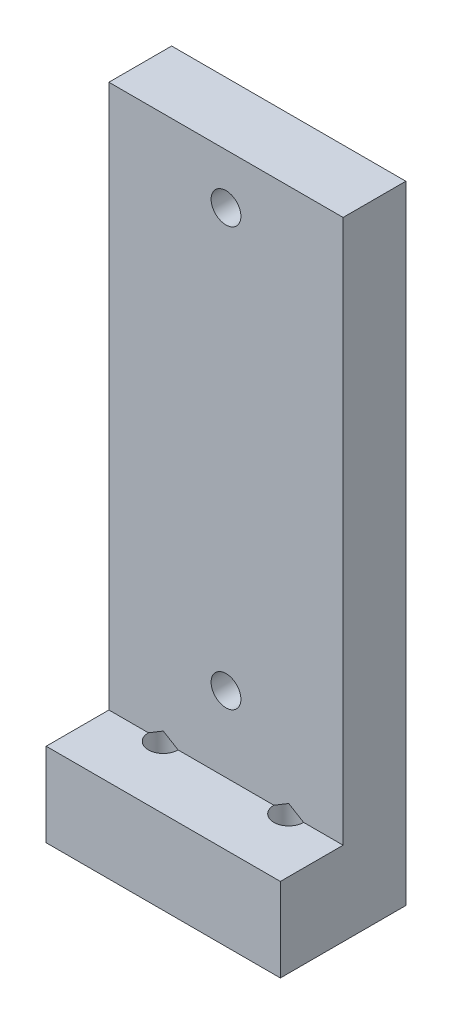
ISO-10303-21;
HEADER;
FILE_DESCRIPTION(('STEP AP214'),'2;1');
FILE_NAME('part.step','',(''),(''),'','','');
FILE_SCHEMA(('AUTOMOTIVE_DESIGN { 1 0 10303 214 1 1 1 1 }'));
ENDSEC;
DATA;
#1=APPLICATION_CONTEXT('core data for automotive mechanical design processes');
#2=APPLICATION_PROTOCOL_DEFINITION('international standard','automotive_design',2000,#1);
#3=PRODUCT_CONTEXT('',#1,'mechanical');
#4=PRODUCT('Part','Part','',(#3));
#5=PRODUCT_RELATED_PRODUCT_CATEGORY('part','',(#4));
#6=PRODUCT_DEFINITION_FORMATION('','',#4);
#7=PRODUCT_DEFINITION_CONTEXT('part definition',#1,'design');
#8=PRODUCT_DEFINITION('design','',#6,#7);
#9=PRODUCT_DEFINITION_SHAPE('','',#8);
#10=(LENGTH_UNIT() NAMED_UNIT(*) SI_UNIT(.MILLI.,.METRE.));
#11=(NAMED_UNIT(*) PLANE_ANGLE_UNIT() SI_UNIT($,.RADIAN.));
#12=(NAMED_UNIT(*) SI_UNIT($,.STERADIAN.) SOLID_ANGLE_UNIT());
#13=UNCERTAINTY_MEASURE_WITH_UNIT(LENGTH_MEASURE(1.E-05),#10,'distance_accuracy_value','');
#14=(GEOMETRIC_REPRESENTATION_CONTEXT(3) GLOBAL_UNCERTAINTY_ASSIGNED_CONTEXT((#13)) GLOBAL_UNIT_ASSIGNED_CONTEXT((#10,
#11,#12)) REPRESENTATION_CONTEXT('',''));
#15=CARTESIAN_POINT('',(0.,0.,0.));
#16=DIRECTION('',(0.,0.,1.));
#17=DIRECTION('',(1.,0.,0.));
#18=AXIS2_PLACEMENT_3D('',#15,#16,#17);
#19=CARTESIAN_POINT('',(8.89000000000001,47.625,4.7625));
#20=DIRECTION('',(-1.,0.,0.));
#21=DIRECTION('',(0.,0.,1.));
#22=AXIS2_PLACEMENT_3D('',#19,#20,#21);
#23=PLANE('',#22);
#24=DIRECTION('',(0.,1.,0.));
#25=VECTOR('',#24,1.);
#26=CARTESIAN_POINT('',(8.89000000000001,-18.4067869616074,0.));
#27=LINE('',#26,#25);
#28=CARTESIAN_POINT('',(8.89000000000001,6.35,0.));
#29=VERTEX_POINT('',#28);
#30=CARTESIAN_POINT('',(8.89000000000001,47.625,0.));
#31=VERTEX_POINT('',#30);
#32=EDGE_CURVE('E158',#29,#31,#27,.T.);
#33=ORIENTED_EDGE('',*,*,#32,.F.);
#34=DIRECTION('',(0.,0.,-1.));
#35=VECTOR('',#34,1.);
#36=CARTESIAN_POINT('',(8.89000000000001,6.35,4.7625));
#37=LINE('',#36,#35);
#38=CARTESIAN_POINT('',(8.89000000000001,6.34999999999999,4.7625));
#39=VERTEX_POINT('',#38);
#40=EDGE_CURVE('E143',#39,#29,#37,.T.);
#41=ORIENTED_EDGE('',*,*,#40,.F.);
#42=DIRECTION('',(0.,-1.,0.));
#43=VECTOR('',#42,1.);
#44=CARTESIAN_POINT('',(8.89000000000001,47.625,4.7625));
#45=LINE('',#44,#43);
#46=CARTESIAN_POINT('',(8.89000000000001,0.,4.7625));
#47=VERTEX_POINT('',#46);
#48=EDGE_CURVE('E179',#39,#47,#45,.T.);
#49=ORIENTED_EDGE('',*,*,#48,.T.);
#50=DIRECTION('',(0.,0.,-1.));
#51=VECTOR('',#50,1.);
#52=CARTESIAN_POINT('',(8.89000000000001,0.,4.7625));
#53=LINE('',#52,#51);
#54=CARTESIAN_POINT('',(8.89000000000001,0.,-4.7625));
#55=VERTEX_POINT('',#54);
#56=EDGE_CURVE('E180',#47,#55,#53,.T.);
#57=ORIENTED_EDGE('',*,*,#56,.T.);
#58=DIRECTION('',(0.,-1.,0.));
#59=VECTOR('',#58,1.);
#60=CARTESIAN_POINT('',(8.89000000000001,47.625,-4.7625));
#61=LINE('',#60,#59);
#62=CARTESIAN_POINT('',(8.89000000000001,47.625,-4.7625));
#63=VERTEX_POINT('',#62);
#64=EDGE_CURVE('E203',#63,#55,#61,.T.);
#65=ORIENTED_EDGE('',*,*,#64,.F.);
#66=DIRECTION('',(0.,0.,-1.));
#67=VECTOR('',#66,1.);
#68=CARTESIAN_POINT('',(8.89000000000001,47.625,4.7625));
#69=LINE('',#68,#67);
#70=EDGE_CURVE('E168',#31,#63,#69,.T.);
#71=ORIENTED_EDGE('',*,*,#70,.F.);
#72=EDGE_LOOP('',(#33,#41,#49,#57,#65,#71));
#73=FACE_BOUND('',#72,.T.);
#74=ADVANCED_FACE('F51',(#73),#23,.F.);
#75=CARTESIAN_POINT('',(-8.88999999999999,47.625,-4.7625));
#76=DIRECTION('',(0.,0.,1.));
#77=DIRECTION('',(1.,0.,0.));
#78=AXIS2_PLACEMENT_3D('',#75,#76,#77);
#79=PLANE('',#78);
#80=CARTESIAN_POINT('',(0.,43.815,-4.7625));
#81=DIRECTION('',(0.,0.,-1.));
#82=DIRECTION('',(-1.,0.,0.));
#83=AXIS2_PLACEMENT_3D('',#80,#81,#82);
#84=CIRCLE('',#83,1.1303);
#85=CARTESIAN_POINT('',(-1.1303,43.815,-4.7625));
#86=VERTEX_POINT('',#85);
#87=EDGE_CURVE('E216',#86,#86,#84,.T.);
#88=ORIENTED_EDGE('',*,*,#87,.F.);
#89=EDGE_LOOP('',(#88));
#90=FACE_BOUND('',#89,.T.);
#91=CARTESIAN_POINT('',(0.,12.065,-4.7625));
#92=DIRECTION('',(0.,0.,-1.));
#93=DIRECTION('',(-1.,0.,0.));
#94=AXIS2_PLACEMENT_3D('',#91,#92,#93);
#95=CIRCLE('',#94,1.1303);
#96=CARTESIAN_POINT('',(-1.1303,12.065,-4.7625));
#97=VERTEX_POINT('',#96);
#98=EDGE_CURVE('E223',#97,#97,#95,.T.);
#99=ORIENTED_EDGE('',*,*,#98,.F.);
#100=EDGE_LOOP('',(#99));
#101=FACE_BOUND('',#100,.T.);
#102=DIRECTION('',(-1.,0.,0.));
#103=VECTOR('',#102,1.);
#104=CARTESIAN_POINT('',(-8.88999999999999,0.,-4.7625));
#105=LINE('',#104,#103);
#106=CARTESIAN_POINT('',(-8.88999999999999,0.,-4.7625));
#107=VERTEX_POINT('',#106);
#108=EDGE_CURVE('E184',#55,#107,#105,.T.);
#109=ORIENTED_EDGE('',*,*,#108,.T.);
#110=DIRECTION('',(0.,-1.,0.));
#111=VECTOR('',#110,1.);
#112=CARTESIAN_POINT('',(-8.88999999999999,47.625,-4.7625));
#113=LINE('',#112,#111);
#114=CARTESIAN_POINT('',(-8.88999999999999,47.625,-4.7625));
#115=VERTEX_POINT('',#114);
#116=EDGE_CURVE('E199',#115,#107,#113,.T.);
#117=ORIENTED_EDGE('',*,*,#116,.F.);
#118=DIRECTION('',(-1.,0.,0.));
#119=VECTOR('',#118,1.);
#120=CARTESIAN_POINT('',(-8.88999999999999,47.625,-4.7625));
#121=LINE('',#120,#119);
#122=EDGE_CURVE('E171',#63,#115,#121,.T.);
#123=ORIENTED_EDGE('',*,*,#122,.F.);
#124=ORIENTED_EDGE('',*,*,#64,.T.);
#125=EDGE_LOOP('',(#109,#117,#123,#124));
#126=FACE_BOUND('',#125,.T.);
#127=ADVANCED_FACE('F268',(#90,#101,#126),#79,.F.);
#128=CARTESIAN_POINT('',(-8.88999999999999,47.625,4.7625));
#129=DIRECTION('',(1.,0.,0.));
#130=DIRECTION('',(0.,0.,-1.));
#131=AXIS2_PLACEMENT_3D('',#128,#129,#130);
#132=PLANE('',#131);
#133=DIRECTION('',(0.,-1.,0.));
#134=VECTOR('',#133,1.);
#135=CARTESIAN_POINT('',(-8.88999999999999,47.625,4.7625));
#136=LINE('',#135,#134);
#137=CARTESIAN_POINT('',(-8.88999999999999,6.35,4.7625));
#138=VERTEX_POINT('',#137);
#139=CARTESIAN_POINT('',(-8.88999999999999,0.,4.7625));
#140=VERTEX_POINT('',#139);
#141=EDGE_CURVE('E196',#138,#140,#136,.T.);
#142=ORIENTED_EDGE('',*,*,#141,.F.);
#143=DIRECTION('',(0.,0.,1.));
#144=VECTOR('',#143,1.);
#145=CARTESIAN_POINT('',(-8.88999999999999,6.35,4.7625));
#146=LINE('',#145,#144);
#147=CARTESIAN_POINT('',(-8.88999999999999,6.35,0.));
#148=VERTEX_POINT('',#147);
#149=EDGE_CURVE('E153',#148,#138,#146,.T.);
#150=ORIENTED_EDGE('',*,*,#149,.F.);
#151=DIRECTION('',(0.,1.,0.));
#152=VECTOR('',#151,1.);
#153=CARTESIAN_POINT('',(-8.88999999999999,-18.4067869616074,0.));
#154=LINE('',#153,#152);
#155=CARTESIAN_POINT('',(-8.88999999999999,47.625,0.));
#156=VERTEX_POINT('',#155);
#157=EDGE_CURVE('E146',#148,#156,#154,.T.);
#158=ORIENTED_EDGE('',*,*,#157,.T.);
#159=DIRECTION('',(0.,0.,1.));
#160=VECTOR('',#159,1.);
#161=CARTESIAN_POINT('',(-8.88999999999999,47.625,4.7625));
#162=LINE('',#161,#160);
#163=EDGE_CURVE('E175',#115,#156,#162,.T.);
#164=ORIENTED_EDGE('',*,*,#163,.F.);
#165=ORIENTED_EDGE('',*,*,#116,.T.);
#166=DIRECTION('',(0.,0.,1.));
#167=VECTOR('',#166,1.);
#168=CARTESIAN_POINT('',(-8.88999999999999,0.,4.7625));
#169=LINE('',#168,#167);
#170=EDGE_CURVE('E187',#107,#140,#169,.T.);
#171=ORIENTED_EDGE('',*,*,#170,.T.);
#172=EDGE_LOOP('',(#142,#150,#158,#164,#165,#171));
#173=FACE_BOUND('',#172,.T.);
#174=ADVANCED_FACE('F253',(#173),#132,.F.);
#175=CARTESIAN_POINT('',(-8.88999999999999,47.625,4.7625));
#176=DIRECTION('',(0.,0.,-1.));
#177=DIRECTION('',(-1.,0.,0.));
#178=AXIS2_PLACEMENT_3D('',#175,#176,#177);
#179=PLANE('',#178);
#180=ORIENTED_EDGE('',*,*,#48,.F.);
#181=DIRECTION('',(1.,0.,0.));
#182=VECTOR('',#181,1.);
#183=CARTESIAN_POINT('',(-8.88999999999999,6.35,4.7625));
#184=LINE('',#183,#182);
#185=EDGE_CURVE('E166',#138,#39,#184,.T.);
#186=ORIENTED_EDGE('',*,*,#185,.F.);
#187=ORIENTED_EDGE('',*,*,#141,.T.);
#188=DIRECTION('',(1.,0.,0.));
#189=VECTOR('',#188,1.);
#190=CARTESIAN_POINT('',(-8.88999999999999,0.,4.7625));
#191=LINE('',#190,#189);
#192=EDGE_CURVE('E172',#140,#47,#191,.T.);
#193=ORIENTED_EDGE('',*,*,#192,.T.);
#194=EDGE_LOOP('',(#180,#186,#187,#193));
#195=FACE_BOUND('',#194,.T.);
#196=ADVANCED_FACE('F252',(#195),#179,.F.);
#197=CARTESIAN_POINT('',(0.,47.625,0.));
#198=DIRECTION('',(0.,-1.,0.));
#199=DIRECTION('',(0.,0.,-1.));
#200=AXIS2_PLACEMENT_3D('',#197,#198,#199);
#201=PLANE('',#200);
#202=ORIENTED_EDGE('',*,*,#163,.T.);
#203=DIRECTION('',(-1.,0.,0.));
#204=VECTOR('',#203,1.);
#205=CARTESIAN_POINT('',(-8.88999999999999,47.625,0.));
#206=LINE('',#205,#204);
#207=EDGE_CURVE('E241',#31,#156,#206,.T.);
#208=ORIENTED_EDGE('',*,*,#207,.F.);
#209=ORIENTED_EDGE('',*,*,#70,.T.);
#210=ORIENTED_EDGE('',*,*,#122,.T.);
#211=EDGE_LOOP('',(#202,#208,#209,#210));
#212=FACE_BOUND('',#211,.T.);
#213=ADVANCED_FACE('F266',(#212),#201,.F.);
#214=CARTESIAN_POINT('',(0.,0.,0.));
#215=DIRECTION('',(0.,-1.,0.));
#216=DIRECTION('',(0.,0.,-1.));
#217=AXIS2_PLACEMENT_3D('',#214,#215,#216);
#218=PLANE('',#217);
#219=CARTESIAN_POINT('',(4.7625,0.,0.));
#220=DIRECTION('',(0.,-1.,0.));
#221=DIRECTION('',(0.,0.,-1.));
#222=AXIS2_PLACEMENT_3D('',#219,#220,#221);
#223=CIRCLE('',#222,1.13029999999999);
#224=CARTESIAN_POINT('',(4.7625,0.,-1.13029999999999));
#225=VERTEX_POINT('',#224);
#226=EDGE_CURVE('E128',#225,#225,#223,.T.);
#227=ORIENTED_EDGE('',*,*,#226,.F.);
#228=EDGE_LOOP('',(#227));
#229=FACE_BOUND('',#228,.T.);
#230=CARTESIAN_POINT('',(-4.7625,0.,0.));
#231=DIRECTION('',(0.,-1.,0.));
#232=DIRECTION('',(0.,0.,-1.));
#233=AXIS2_PLACEMENT_3D('',#230,#231,#232);
#234=CIRCLE('',#233,1.13029999999999);
#235=CARTESIAN_POINT('',(-4.7625,0.,-1.13029999999999));
#236=VERTEX_POINT('',#235);
#237=EDGE_CURVE('E136',#236,#236,#234,.T.);
#238=ORIENTED_EDGE('',*,*,#237,.F.);
#239=EDGE_LOOP('',(#238));
#240=FACE_BOUND('',#239,.T.);
#241=ORIENTED_EDGE('',*,*,#56,.F.);
#242=ORIENTED_EDGE('',*,*,#192,.F.);
#243=ORIENTED_EDGE('',*,*,#170,.F.);
#244=ORIENTED_EDGE('',*,*,#108,.F.);
#245=EDGE_LOOP('',(#241,#242,#243,#244));
#246=FACE_BOUND('',#245,.T.);
#247=ADVANCED_FACE('F260',(#229,#240,#246),#218,.T.);
#248=CARTESIAN_POINT('',(0.,6.35,0.));
#249=DIRECTION('',(0.,-1.,0.));
#250=DIRECTION('',(0.,0.,-1.));
#251=AXIS2_PLACEMENT_3D('',#248,#249,#250);
#252=PLANE('',#251);
#253=DIRECTION('',(-1.,0.,0.));
#254=VECTOR('',#253,1.);
#255=CARTESIAN_POINT('',(-8.88999999999999,6.35,0.));
#256=LINE('',#255,#254);
#257=CARTESIAN_POINT('',(5.8928,6.35,0.));
#258=VERTEX_POINT('',#257);
#259=EDGE_CURVE('E139',#29,#258,#256,.T.);
#260=ORIENTED_EDGE('',*,*,#259,.T.);
#261=CARTESIAN_POINT('',(4.7625,6.35,0.));
#262=DIRECTION('',(0.,-1.,0.));
#263=DIRECTION('',(0.,0.,-1.));
#264=AXIS2_PLACEMENT_3D('',#261,#262,#263);
#265=CIRCLE('',#264,1.1303);
#266=CARTESIAN_POINT('',(3.6322,6.35,0.));
#267=VERTEX_POINT('',#266);
#268=EDGE_CURVE('E127',#258,#267,#265,.T.);
#269=ORIENTED_EDGE('',*,*,#268,.T.);
#270=CARTESIAN_POINT('',(-3.6322,6.35,0.));
#271=VERTEX_POINT('',#270);
#272=EDGE_CURVE('E147',#267,#271,#256,.T.);
#273=ORIENTED_EDGE('',*,*,#272,.T.);
#274=CARTESIAN_POINT('',(-4.7625,6.35,0.));
#275=DIRECTION('',(0.,-1.,0.));
#276=DIRECTION('',(0.,0.,-1.));
#277=AXIS2_PLACEMENT_3D('',#274,#275,#276);
#278=CIRCLE('',#277,1.1303);
#279=CARTESIAN_POINT('',(-5.8928,6.35,0.));
#280=VERTEX_POINT('',#279);
#281=EDGE_CURVE('E238',#271,#280,#278,.T.);
#282=ORIENTED_EDGE('',*,*,#281,.T.);
#283=EDGE_CURVE('E149',#280,#148,#256,.T.);
#284=ORIENTED_EDGE('',*,*,#283,.T.);
#285=ORIENTED_EDGE('',*,*,#149,.T.);
#286=ORIENTED_EDGE('',*,*,#185,.T.);
#287=ORIENTED_EDGE('',*,*,#40,.T.);
#288=EDGE_LOOP('',(#260,#269,#273,#282,#284,#285,#286,#287));
#289=FACE_BOUND('',#288,.T.);
#290=ADVANCED_FACE('F141',(#289),#252,.F.);
#291=CARTESIAN_POINT('',(-8.88999999999999,-18.4067869616074,0.));
#292=DIRECTION('',(0.,0.,-1.));
#293=DIRECTION('',(-1.,0.,0.));
#294=AXIS2_PLACEMENT_3D('',#291,#292,#293);
#295=PLANE('',#294);
#296=CARTESIAN_POINT('',(0.,43.815,0.));
#297=DIRECTION('',(0.,0.,-1.));
#298=DIRECTION('',(-1.,0.,0.));
#299=AXIS2_PLACEMENT_3D('',#296,#297,#298);
#300=CIRCLE('',#299,1.1303);
#301=CARTESIAN_POINT('',(-1.1303,43.815,0.));
#302=VERTEX_POINT('',#301);
#303=EDGE_CURVE('E54',#302,#302,#300,.T.);
#304=ORIENTED_EDGE('',*,*,#303,.T.);
#305=EDGE_LOOP('',(#304));
#306=FACE_BOUND('',#305,.T.);
#307=CARTESIAN_POINT('',(0.,12.065,0.));
#308=DIRECTION('',(0.,0.,-1.));
#309=DIRECTION('',(-1.,0.,0.));
#310=AXIS2_PLACEMENT_3D('',#307,#308,#309);
#311=CIRCLE('',#310,1.1303);
#312=CARTESIAN_POINT('',(-1.1303,12.065,0.));
#313=VERTEX_POINT('',#312);
#314=EDGE_CURVE('E213',#313,#313,#311,.T.);
#315=ORIENTED_EDGE('',*,*,#314,.T.);
#316=EDGE_LOOP('',(#315));
#317=FACE_BOUND('',#316,.T.);
#318=DIRECTION('',(0.857167300702112,0.515038074910055,0.));
#319=VECTOR('',#318,1.);
#320=CARTESIAN_POINT('',(4.7625,7.02915275768685,0.));
#321=LINE('',#320,#319);
#322=CARTESIAN_POINT('',(4.7625,7.02915275768685,0.));
#323=VERTEX_POINT('',#322);
#324=EDGE_CURVE('E60',#267,#323,#321,.T.);
#325=ORIENTED_EDGE('',*,*,#324,.T.);
#326=DIRECTION('',(0.857167300702112,-0.515038074910055,0.));
#327=VECTOR('',#326,1.);
#328=CARTESIAN_POINT('',(4.7625,7.02915275768685,0.));
#329=LINE('',#328,#327);
#330=EDGE_CURVE('E12',#323,#258,#329,.T.);
#331=ORIENTED_EDGE('',*,*,#330,.T.);
#332=ORIENTED_EDGE('',*,*,#259,.F.);
#333=ORIENTED_EDGE('',*,*,#32,.T.);
#334=ORIENTED_EDGE('',*,*,#207,.T.);
#335=ORIENTED_EDGE('',*,*,#157,.F.);
#336=ORIENTED_EDGE('',*,*,#283,.F.);
#337=DIRECTION('',(0.857167300702112,0.515038074910055,0.));
#338=VECTOR('',#337,1.);
#339=CARTESIAN_POINT('',(-4.7625,7.02915275768685,0.));
#340=LINE('',#339,#338);
#341=CARTESIAN_POINT('',(-4.7625,7.02915275768685,0.));
#342=VERTEX_POINT('',#341);
#343=EDGE_CURVE('E207',#280,#342,#340,.T.);
#344=ORIENTED_EDGE('',*,*,#343,.T.);
#345=DIRECTION('',(0.857167300702112,-0.515038074910055,0.));
#346=VECTOR('',#345,1.);
#347=CARTESIAN_POINT('',(-4.7625,7.02915275768685,0.));
#348=LINE('',#347,#346);
#349=EDGE_CURVE('E74',#342,#271,#348,.T.);
#350=ORIENTED_EDGE('',*,*,#349,.T.);
#351=ORIENTED_EDGE('',*,*,#272,.F.);
#352=EDGE_LOOP('',(#325,#331,#332,#333,#334,#335,#336,#344,#350,#351));
#353=FACE_BOUND('',#352,.T.);
#354=ADVANCED_FACE('F138',(#306,#317,#353),#295,.F.);
#355=CARTESIAN_POINT('',(-4.7625,6.35,0.));
#356=DIRECTION('',(0.,-1.,0.));
#357=DIRECTION('',(0.,0.,-1.));
#358=AXIS2_PLACEMENT_3D('',#355,#356,#357);
#359=CONICAL_SURFACE('',#358,1.1303,1.02974425867665);
#360=ORIENTED_EDGE('',*,*,#343,.F.);
#361=EDGE_CURVE('E237',#280,#271,#278,.T.);
#362=ORIENTED_EDGE('',*,*,#361,.T.);
#363=ORIENTED_EDGE('',*,*,#349,.F.);
#364=EDGE_LOOP('',(#360,#362,#363));
#365=FACE_BOUND('',#364,.T.);
#366=ADVANCED_FACE('F270',(#365),#359,.F.);
#367=CARTESIAN_POINT('',(-4.7625,0.,0.));
#368=DIRECTION('',(0.,-1.,0.));
#369=DIRECTION('',(0.,0.,-1.));
#370=AXIS2_PLACEMENT_3D('',#367,#368,#369);
#371=CYLINDRICAL_SURFACE('',#370,1.13029999999999);
#372=ORIENTED_EDGE('',*,*,#281,.F.);
#373=ORIENTED_EDGE('',*,*,#361,.F.);
#374=EDGE_LOOP('',(#372,#373));
#375=FACE_BOUND('',#374,.T.);
#376=ORIENTED_EDGE('',*,*,#237,.T.);
#377=EDGE_LOOP('',(#376));
#378=FACE_BOUND('',#377,.T.);
#379=ADVANCED_FACE('F273',(#375,#378),#371,.F.);
#380=CARTESIAN_POINT('',(4.7625,6.35,0.));
#381=DIRECTION('',(0.,-1.,0.));
#382=DIRECTION('',(0.,0.,-1.));
#383=AXIS2_PLACEMENT_3D('',#380,#381,#382);
#384=CONICAL_SURFACE('',#383,1.1303,1.02974425867665);
#385=ORIENTED_EDGE('',*,*,#324,.F.);
#386=EDGE_CURVE('E121',#267,#258,#265,.T.);
#387=ORIENTED_EDGE('',*,*,#386,.T.);
#388=ORIENTED_EDGE('',*,*,#330,.F.);
#389=EDGE_LOOP('',(#385,#387,#388));
#390=FACE_BOUND('',#389,.T.);
#391=ADVANCED_FACE('F123',(#390),#384,.F.);
#392=CARTESIAN_POINT('',(4.7625,0.,0.));
#393=DIRECTION('',(0.,-1.,0.));
#394=DIRECTION('',(0.,0.,-1.));
#395=AXIS2_PLACEMENT_3D('',#392,#393,#394);
#396=CYLINDRICAL_SURFACE('',#395,1.13029999999999);
#397=ORIENTED_EDGE('',*,*,#268,.F.);
#398=ORIENTED_EDGE('',*,*,#386,.F.);
#399=EDGE_LOOP('',(#397,#398));
#400=FACE_BOUND('',#399,.T.);
#401=ORIENTED_EDGE('',*,*,#226,.T.);
#402=EDGE_LOOP('',(#401));
#403=FACE_BOUND('',#402,.T.);
#404=ADVANCED_FACE('F130',(#400,#403),#396,.F.);
#405=CARTESIAN_POINT('',(0.,12.065,4.7625));
#406=DIRECTION('',(0.,0.,-1.));
#407=DIRECTION('',(-1.,0.,0.));
#408=AXIS2_PLACEMENT_3D('',#405,#406,#407);
#409=CYLINDRICAL_SURFACE('',#408,1.1303);
#410=CARTESIAN_POINT('',(-1.1303,12.065,-4.7625));
#411=CARTESIAN_POINT('',(-1.1303,12.065,-4.712890625));
#412=CARTESIAN_POINT('',(-1.1303,12.065,-4.66328125));
#413=CARTESIAN_POINT('',(-1.1303,12.065,-4.5640625));
#414=CARTESIAN_POINT('',(-1.1303,12.065,-4.514453125));
#415=CARTESIAN_POINT('',(-1.1303,12.065,-4.415234375));
#416=CARTESIAN_POINT('',(-1.1303,12.065,-4.365625));
#417=CARTESIAN_POINT('',(-1.1303,12.065,-4.26640625));
#418=CARTESIAN_POINT('',(-1.1303,12.065,-4.216796875));
#419=CARTESIAN_POINT('',(-1.1303,12.065,-4.117578125));
#420=CARTESIAN_POINT('',(-1.1303,12.065,-4.06796875));
#421=CARTESIAN_POINT('',(-1.1303,12.065,-3.96875));
#422=CARTESIAN_POINT('',(-1.1303,12.065,-3.919140625));
#423=CARTESIAN_POINT('',(-1.1303,12.065,-3.819921875));
#424=CARTESIAN_POINT('',(-1.1303,12.065,-3.7703125));
#425=CARTESIAN_POINT('',(-1.1303,12.065,-3.67109375));
#426=CARTESIAN_POINT('',(-1.1303,12.065,-3.621484375));
#427=CARTESIAN_POINT('',(-1.1303,12.065,-3.522265625));
#428=CARTESIAN_POINT('',(-1.1303,12.065,-3.47265625));
#429=CARTESIAN_POINT('',(-1.1303,12.065,-3.3734375));
#430=CARTESIAN_POINT('',(-1.1303,12.065,-3.323828125));
#431=CARTESIAN_POINT('',(-1.1303,12.065,-3.224609375));
#432=CARTESIAN_POINT('',(-1.1303,12.065,-3.175));
#433=CARTESIAN_POINT('',(-1.1303,12.065,-3.07578125));
#434=CARTESIAN_POINT('',(-1.1303,12.065,-3.026171875));
#435=CARTESIAN_POINT('',(-1.1303,12.065,-2.926953125));
#436=CARTESIAN_POINT('',(-1.1303,12.065,-2.87734375));
#437=CARTESIAN_POINT('',(-1.1303,12.065,-2.778125));
#438=CARTESIAN_POINT('',(-1.1303,12.065,-2.728515625));
#439=CARTESIAN_POINT('',(-1.1303,12.065,-2.629296875));
#440=CARTESIAN_POINT('',(-1.1303,12.065,-2.5796875));
#441=CARTESIAN_POINT('',(-1.1303,12.065,-2.48046875));
#442=CARTESIAN_POINT('',(-1.1303,12.065,-2.430859375));
#443=CARTESIAN_POINT('',(-1.1303,12.065,-2.331640625));
#444=CARTESIAN_POINT('',(-1.1303,12.065,-2.28203125));
#445=CARTESIAN_POINT('',(-1.1303,12.065,-2.1828125));
#446=CARTESIAN_POINT('',(-1.1303,12.065,-2.133203125));
#447=CARTESIAN_POINT('',(-1.1303,12.065,-2.033984375));
#448=CARTESIAN_POINT('',(-1.1303,12.065,-1.984375));
#449=CARTESIAN_POINT('',(-1.1303,12.065,-1.88515625));
#450=CARTESIAN_POINT('',(-1.1303,12.065,-1.835546875));
#451=CARTESIAN_POINT('',(-1.1303,12.065,-1.736328125));
#452=CARTESIAN_POINT('',(-1.1303,12.065,-1.68671875));
#453=CARTESIAN_POINT('',(-1.1303,12.065,-1.5875));
#454=CARTESIAN_POINT('',(-1.1303,12.065,-1.537890625));
#455=CARTESIAN_POINT('',(-1.1303,12.065,-1.438671875));
#456=CARTESIAN_POINT('',(-1.1303,12.065,-1.3890625));
#457=CARTESIAN_POINT('',(-1.1303,12.065,-1.28984375));
#458=CARTESIAN_POINT('',(-1.1303,12.065,-1.240234375));
#459=CARTESIAN_POINT('',(-1.1303,12.065,-1.141015625));
#460=CARTESIAN_POINT('',(-1.1303,12.065,-1.09140625));
#461=CARTESIAN_POINT('',(-1.1303,12.065,-0.992187500000002));
#462=CARTESIAN_POINT('',(-1.1303,12.065,-0.942578125000002));
#463=CARTESIAN_POINT('',(-1.1303,12.065,-0.843359375000002));
#464=CARTESIAN_POINT('',(-1.1303,12.065,-0.793750000000002));
#465=CARTESIAN_POINT('',(-1.1303,12.065,-0.694531250000002));
#466=CARTESIAN_POINT('',(-1.1303,12.065,-0.644921875000002));
#467=CARTESIAN_POINT('',(-1.1303,12.065,-0.545703125000002));
#468=CARTESIAN_POINT('',(-1.1303,12.065,-0.496093750000002));
#469=CARTESIAN_POINT('',(-1.1303,12.065,-0.396875000000002));
#470=CARTESIAN_POINT('',(-1.1303,12.065,-0.347265625000002));
#471=CARTESIAN_POINT('',(-1.1303,12.065,-0.248046875000002));
#472=CARTESIAN_POINT('',(-1.1303,12.065,-0.198437500000002));
#473=CARTESIAN_POINT('',(-1.1303,12.065,-0.0992187500000018));
#474=CARTESIAN_POINT('',(-1.1303,12.065,-0.0496093750000018));
#475=CARTESIAN_POINT('',(-1.1303,12.065,0.));
#476=B_SPLINE_CURVE_WITH_KNOTS('',3,(#410,#411,#412,#413,#414,#415,#416,#417,#418,#419,#420,
#421,#422,#423,#424,#425,#426,#427,#428,#429,#430,#431,#432,#433,#434,#435,#436,#437,#438,#439,
#440,#441,#442,#443,#444,#445,#446,#447,#448,#449,#450,#451,#452,#453,#454,#455,#456,#457,#458,
#459,#460,#461,#462,#463,#464,#465,#466,#467,#468,#469,#470,#471,#472,#473,#474,#475),
.UNSPECIFIED.,.F.,.F.,(4,2,2,2,2,2,2,2,2,2,2,2,2,2,2,2,2,2,2,2,2,2,2,2,2,2,2,2,2,2,2,2,4),(0.,
0.148828125,0.29765625,0.446484375,0.5953125,0.744140625,0.892968750000001,1.041796875,1.190625,
1.339453125,1.48828125,1.637109375,1.7859375,1.934765625,2.08359375,2.232421875,2.38125,
2.530078125,2.67890625,2.827734375,2.9765625,3.125390625,3.27421875,3.423046875,3.571875,
3.720703125,3.86953125,4.018359375,4.1671875,4.316015625,4.46484375,4.613671875,4.7625),.UNSPECIFIED.);
#477=EDGE_CURVE('BSEAM366',#97,#313,#476,.T.);
#478=ORIENTED_EDGE('',*,*,#98,.T.);
#479=ORIENTED_EDGE('',*,*,#314,.F.);
#480=ORIENTED_EDGE('',*,*,#477,.T.);
#481=ORIENTED_EDGE('',*,*,#477,.F.);
#482=EDGE_LOOP('',(#478,#480,#479,#481));
#483=FACE_BOUND('',#482,.T.);
#484=ADVANCED_FACE('F366',(#483),#409,.F.);
#485=CARTESIAN_POINT('',(0.,43.815,4.7625));
#486=DIRECTION('',(0.,0.,-1.));
#487=DIRECTION('',(-1.,0.,0.));
#488=AXIS2_PLACEMENT_3D('',#485,#486,#487);
#489=CYLINDRICAL_SURFACE('',#488,1.1303);
#490=CARTESIAN_POINT('',(-1.1303,43.815,-4.7625));
#491=CARTESIAN_POINT('',(-1.1303,43.815,-4.712890625));
#492=CARTESIAN_POINT('',(-1.1303,43.815,-4.66328125));
#493=CARTESIAN_POINT('',(-1.1303,43.815,-4.5640625));
#494=CARTESIAN_POINT('',(-1.1303,43.815,-4.514453125));
#495=CARTESIAN_POINT('',(-1.1303,43.815,-4.415234375));
#496=CARTESIAN_POINT('',(-1.1303,43.815,-4.365625));
#497=CARTESIAN_POINT('',(-1.1303,43.815,-4.26640625));
#498=CARTESIAN_POINT('',(-1.1303,43.815,-4.216796875));
#499=CARTESIAN_POINT('',(-1.1303,43.815,-4.117578125));
#500=CARTESIAN_POINT('',(-1.1303,43.815,-4.06796875));
#501=CARTESIAN_POINT('',(-1.1303,43.815,-3.96875));
#502=CARTESIAN_POINT('',(-1.1303,43.815,-3.919140625));
#503=CARTESIAN_POINT('',(-1.1303,43.815,-3.819921875));
#504=CARTESIAN_POINT('',(-1.1303,43.815,-3.7703125));
#505=CARTESIAN_POINT('',(-1.1303,43.815,-3.67109375));
#506=CARTESIAN_POINT('',(-1.1303,43.815,-3.621484375));
#507=CARTESIAN_POINT('',(-1.1303,43.815,-3.522265625));
#508=CARTESIAN_POINT('',(-1.1303,43.815,-3.47265625));
#509=CARTESIAN_POINT('',(-1.1303,43.815,-3.3734375));
#510=CARTESIAN_POINT('',(-1.1303,43.815,-3.323828125));
#511=CARTESIAN_POINT('',(-1.1303,43.815,-3.224609375));
#512=CARTESIAN_POINT('',(-1.1303,43.815,-3.175));
#513=CARTESIAN_POINT('',(-1.1303,43.815,-3.07578125));
#514=CARTESIAN_POINT('',(-1.1303,43.815,-3.026171875));
#515=CARTESIAN_POINT('',(-1.1303,43.815,-2.926953125));
#516=CARTESIAN_POINT('',(-1.1303,43.815,-2.87734375));
#517=CARTESIAN_POINT('',(-1.1303,43.815,-2.778125));
#518=CARTESIAN_POINT('',(-1.1303,43.815,-2.728515625));
#519=CARTESIAN_POINT('',(-1.1303,43.815,-2.629296875));
#520=CARTESIAN_POINT('',(-1.1303,43.815,-2.5796875));
#521=CARTESIAN_POINT('',(-1.1303,43.815,-2.48046875));
#522=CARTESIAN_POINT('',(-1.1303,43.815,-2.430859375));
#523=CARTESIAN_POINT('',(-1.1303,43.815,-2.331640625));
#524=CARTESIAN_POINT('',(-1.1303,43.815,-2.28203125));
#525=CARTESIAN_POINT('',(-1.1303,43.815,-2.1828125));
#526=CARTESIAN_POINT('',(-1.1303,43.815,-2.133203125));
#527=CARTESIAN_POINT('',(-1.1303,43.815,-2.033984375));
#528=CARTESIAN_POINT('',(-1.1303,43.815,-1.984375));
#529=CARTESIAN_POINT('',(-1.1303,43.815,-1.88515625));
#530=CARTESIAN_POINT('',(-1.1303,43.815,-1.835546875));
#531=CARTESIAN_POINT('',(-1.1303,43.815,-1.736328125));
#532=CARTESIAN_POINT('',(-1.1303,43.815,-1.68671875));
#533=CARTESIAN_POINT('',(-1.1303,43.815,-1.5875));
#534=CARTESIAN_POINT('',(-1.1303,43.815,-1.537890625));
#535=CARTESIAN_POINT('',(-1.1303,43.815,-1.438671875));
#536=CARTESIAN_POINT('',(-1.1303,43.815,-1.3890625));
#537=CARTESIAN_POINT('',(-1.1303,43.815,-1.28984375));
#538=CARTESIAN_POINT('',(-1.1303,43.815,-1.240234375));
#539=CARTESIAN_POINT('',(-1.1303,43.815,-1.141015625));
#540=CARTESIAN_POINT('',(-1.1303,43.815,-1.09140625));
#541=CARTESIAN_POINT('',(-1.1303,43.815,-0.992187500000002));
#542=CARTESIAN_POINT('',(-1.1303,43.815,-0.942578125000002));
#543=CARTESIAN_POINT('',(-1.1303,43.815,-0.843359375000002));
#544=CARTESIAN_POINT('',(-1.1303,43.815,-0.793750000000002));
#545=CARTESIAN_POINT('',(-1.1303,43.815,-0.694531250000002));
#546=CARTESIAN_POINT('',(-1.1303,43.815,-0.644921875000002));
#547=CARTESIAN_POINT('',(-1.1303,43.815,-0.545703125000002));
#548=CARTESIAN_POINT('',(-1.1303,43.815,-0.496093750000002));
#549=CARTESIAN_POINT('',(-1.1303,43.815,-0.396875000000002));
#550=CARTESIAN_POINT('',(-1.1303,43.815,-0.347265625000002));
#551=CARTESIAN_POINT('',(-1.1303,43.815,-0.248046875000002));
#552=CARTESIAN_POINT('',(-1.1303,43.815,-0.198437500000002));
#553=CARTESIAN_POINT('',(-1.1303,43.815,-0.0992187500000018));
#554=CARTESIAN_POINT('',(-1.1303,43.815,-0.0496093750000018));
#555=CARTESIAN_POINT('',(-1.1303,43.815,0.));
#556=B_SPLINE_CURVE_WITH_KNOTS('',3,(#490,#491,#492,#493,#494,#495,#496,#497,#498,#499,#500,
#501,#502,#503,#504,#505,#506,#507,#508,#509,#510,#511,#512,#513,#514,#515,#516,#517,#518,#519,
#520,#521,#522,#523,#524,#525,#526,#527,#528,#529,#530,#531,#532,#533,#534,#535,#536,#537,#538,
#539,#540,#541,#542,#543,#544,#545,#546,#547,#548,#549,#550,#551,#552,#553,#554,#555),
.UNSPECIFIED.,.F.,.F.,(4,2,2,2,2,2,2,2,2,2,2,2,2,2,2,2,2,2,2,2,2,2,2,2,2,2,2,2,2,2,2,2,4),(0.,
0.148828125,0.29765625,0.446484375,0.5953125,0.744140625,0.892968750000001,1.041796875,1.190625,
1.339453125,1.48828125,1.637109375,1.7859375,1.934765625,2.08359375,2.232421875,2.38125,
2.530078125,2.67890625,2.827734375,2.9765625,3.125390625,3.27421875,3.423046875,3.571875,
3.720703125,3.86953125,4.018359375,4.1671875,4.316015625,4.46484375,4.613671875,4.7625),.UNSPECIFIED.);
#557=EDGE_CURVE('BSEAM393',#86,#302,#556,.T.);
#558=ORIENTED_EDGE('',*,*,#87,.T.);
#559=ORIENTED_EDGE('',*,*,#303,.F.);
#560=ORIENTED_EDGE('',*,*,#557,.T.);
#561=ORIENTED_EDGE('',*,*,#557,.F.);
#562=EDGE_LOOP('',(#558,#560,#559,#561));
#563=FACE_BOUND('',#562,.T.);
#564=ADVANCED_FACE('F393',(#563),#489,.F.);
#565=CLOSED_SHELL('',(#74,#127,#174,#196,#213,#247,#290,#354,#366,#379,#391,#404,#484,#564));
#566=MANIFOLD_SOLID_BREP('B2',#565);
#567=ADVANCED_BREP_SHAPE_REPRESENTATION('',(#18,#566),#14);
#568=SHAPE_DEFINITION_REPRESENTATION(#9,#567);
ENDSEC;
END-ISO-10303-21;
